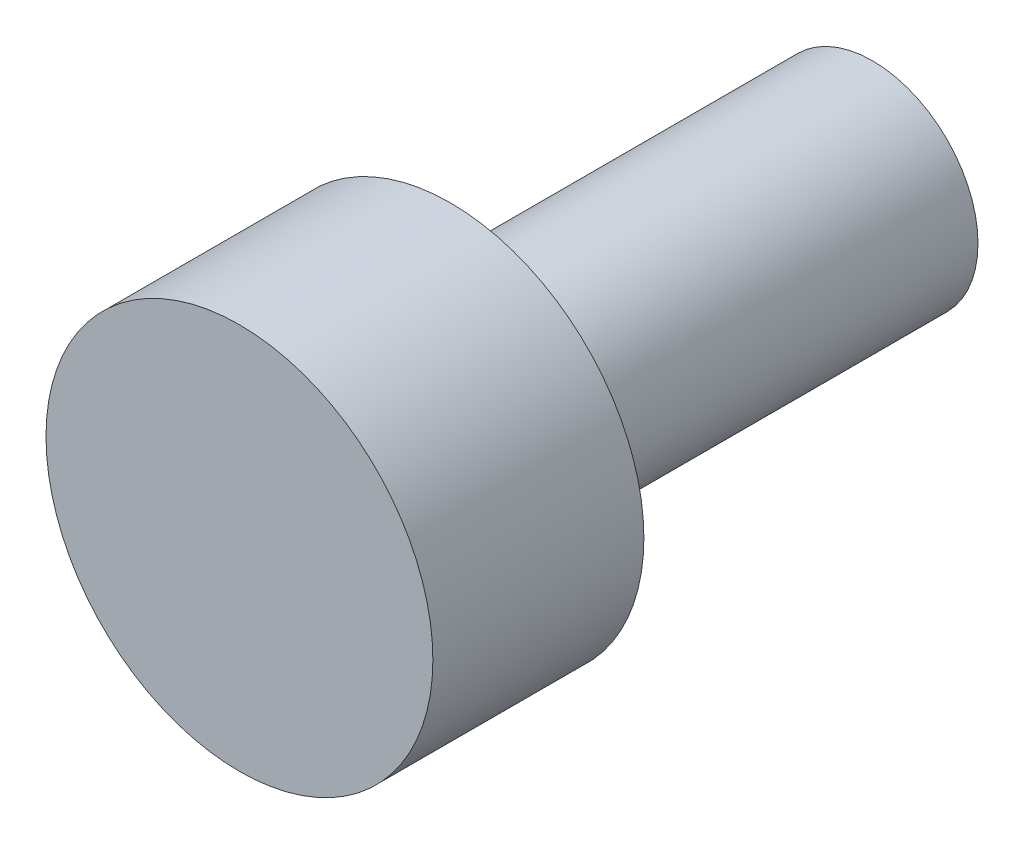
ISO-10303-21;
HEADER;
FILE_DESCRIPTION(('STEP AP214'),'2;1');
FILE_NAME('part.step','',(''),(''),'','','');
FILE_SCHEMA(('AUTOMOTIVE_DESIGN { 1 0 10303 214 1 1 1 1 }'));
ENDSEC;
DATA;
#1=APPLICATION_CONTEXT('core data for automotive mechanical design processes');
#2=APPLICATION_PROTOCOL_DEFINITION('international standard','automotive_design',2000,#1);
#3=PRODUCT_CONTEXT('',#1,'mechanical');
#4=PRODUCT('Part','Part','',(#3));
#5=PRODUCT_RELATED_PRODUCT_CATEGORY('part','',(#4));
#6=PRODUCT_DEFINITION_FORMATION('','',#4);
#7=PRODUCT_DEFINITION_CONTEXT('part definition',#1,'design');
#8=PRODUCT_DEFINITION('design','',#6,#7);
#9=PRODUCT_DEFINITION_SHAPE('','',#8);
#10=(LENGTH_UNIT() NAMED_UNIT(*) SI_UNIT(.MILLI.,.METRE.));
#11=(NAMED_UNIT(*) PLANE_ANGLE_UNIT() SI_UNIT($,.RADIAN.));
#12=(NAMED_UNIT(*) SI_UNIT($,.STERADIAN.) SOLID_ANGLE_UNIT());
#13=UNCERTAINTY_MEASURE_WITH_UNIT(LENGTH_MEASURE(1.E-05),#10,'distance_accuracy_value','');
#14=(GEOMETRIC_REPRESENTATION_CONTEXT(3) GLOBAL_UNCERTAINTY_ASSIGNED_CONTEXT((#13)) GLOBAL_UNIT_ASSIGNED_CONTEXT((#10,
#11,#12)) REPRESENTATION_CONTEXT('',''));
#15=CARTESIAN_POINT('',(0.,0.,0.));
#16=DIRECTION('',(0.,0.,1.));
#17=DIRECTION('',(1.,0.,0.));
#18=AXIS2_PLACEMENT_3D('',#15,#16,#17);
#19=CARTESIAN_POINT('',(0.,0.,6.));
#20=DIRECTION('',(0.,0.,-1.));
#21=DIRECTION('',(-1.,0.,0.));
#22=AXIS2_PLACEMENT_3D('',#19,#20,#21);
#23=CYLINDRICAL_SURFACE('',#22,1.5);
#24=CARTESIAN_POINT('',(0.,0.,6.));
#25=DIRECTION('',(0.,0.,1.));
#26=DIRECTION('',(1.,0.,0.));
#27=AXIS2_PLACEMENT_3D('',#24,#25,#26);
#28=CIRCLE('',#27,1.5);
#29=CARTESIAN_POINT('',(1.5,0.,6.));
#30=VERTEX_POINT('',#29);
#31=EDGE_CURVE('E10',#30,#30,#28,.T.);
#32=ORIENTED_EDGE('',*,*,#31,.F.);
#33=EDGE_LOOP('',(#32));
#34=FACE_BOUND('',#33,.T.);
#35=CARTESIAN_POINT('',(0.,0.,0.));
#36=DIRECTION('',(0.,0.,1.));
#37=DIRECTION('',(1.,0.,0.));
#38=AXIS2_PLACEMENT_3D('',#35,#36,#37);
#39=CIRCLE('',#38,1.5);
#40=CARTESIAN_POINT('',(1.5,0.,0.));
#41=VERTEX_POINT('',#40);
#42=EDGE_CURVE('E40',#41,#41,#39,.T.);
#43=ORIENTED_EDGE('',*,*,#42,.T.);
#44=EDGE_LOOP('',(#43));
#45=FACE_BOUND('',#44,.T.);
#46=ADVANCED_FACE('F37',(#34,#45),#23,.T.);
#47=CARTESIAN_POINT('',(0.,0.,0.));
#48=DIRECTION('',(0.,0.,1.));
#49=DIRECTION('',(1.,0.,0.));
#50=AXIS2_PLACEMENT_3D('',#47,#48,#49);
#51=PLANE('',#50);
#52=ORIENTED_EDGE('',*,*,#42,.F.);
#53=EDGE_LOOP('',(#52));
#54=FACE_BOUND('',#53,.T.);
#55=ADVANCED_FACE('F60',(#54),#51,.F.);
#56=CARTESIAN_POINT('',(0.,0.,9.));
#57=DIRECTION('',(0.,0.,-1.));
#58=DIRECTION('',(-1.,0.,0.));
#59=AXIS2_PLACEMENT_3D('',#56,#57,#58);
#60=CYLINDRICAL_SURFACE('',#59,2.75);
#61=CARTESIAN_POINT('',(0.,0.,9.));
#62=DIRECTION('',(0.,0.,1.));
#63=DIRECTION('',(1.,0.,0.));
#64=AXIS2_PLACEMENT_3D('',#61,#62,#63);
#65=CIRCLE('',#64,2.75);
#66=CARTESIAN_POINT('',(2.75,0.,9.));
#67=VERTEX_POINT('',#66);
#68=EDGE_CURVE('E47',#67,#67,#65,.T.);
#69=ORIENTED_EDGE('',*,*,#68,.F.);
#70=EDGE_LOOP('',(#69));
#71=FACE_BOUND('',#70,.T.);
#72=CARTESIAN_POINT('',(0.,0.,6.));
#73=DIRECTION('',(0.,0.,1.));
#74=DIRECTION('',(1.,0.,0.));
#75=AXIS2_PLACEMENT_3D('',#72,#73,#74);
#76=CIRCLE('',#75,2.75);
#77=CARTESIAN_POINT('',(2.75,0.,6.));
#78=VERTEX_POINT('',#77);
#79=EDGE_CURVE('E49',#78,#78,#76,.T.);
#80=ORIENTED_EDGE('',*,*,#79,.T.);
#81=EDGE_LOOP('',(#80));
#82=FACE_BOUND('',#81,.T.);
#83=ADVANCED_FACE('F57',(#71,#82),#60,.T.);
#84=CARTESIAN_POINT('',(0.,0.,9.));
#85=DIRECTION('',(0.,0.,1.));
#86=DIRECTION('',(1.,0.,0.));
#87=AXIS2_PLACEMENT_3D('',#84,#85,#86);
#88=PLANE('',#87);
#89=ORIENTED_EDGE('',*,*,#68,.T.);
#90=EDGE_LOOP('',(#89));
#91=FACE_BOUND('',#90,.T.);
#92=ADVANCED_FACE('F55',(#91),#88,.T.);
#93=CARTESIAN_POINT('',(0.,0.,6.));
#94=DIRECTION('',(0.,0.,1.));
#95=DIRECTION('',(1.,0.,0.));
#96=AXIS2_PLACEMENT_3D('',#93,#94,#95);
#97=PLANE('',#96);
#98=ORIENTED_EDGE('',*,*,#31,.T.);
#99=EDGE_LOOP('',(#98));
#100=FACE_BOUND('',#99,.T.);
#101=ORIENTED_EDGE('',*,*,#79,.F.);
#102=EDGE_LOOP('',(#101));
#103=FACE_BOUND('',#102,.T.);
#104=ADVANCED_FACE('F64',(#100,#103),#97,.F.);
#105=CLOSED_SHELL('',(#46,#55,#83,#92,#104));
#106=MANIFOLD_SOLID_BREP('B2',#105);
#107=ADVANCED_BREP_SHAPE_REPRESENTATION('',(#18,#106),#14);
#108=SHAPE_DEFINITION_REPRESENTATION(#9,#107);
ENDSEC;
END-ISO-10303-21;
